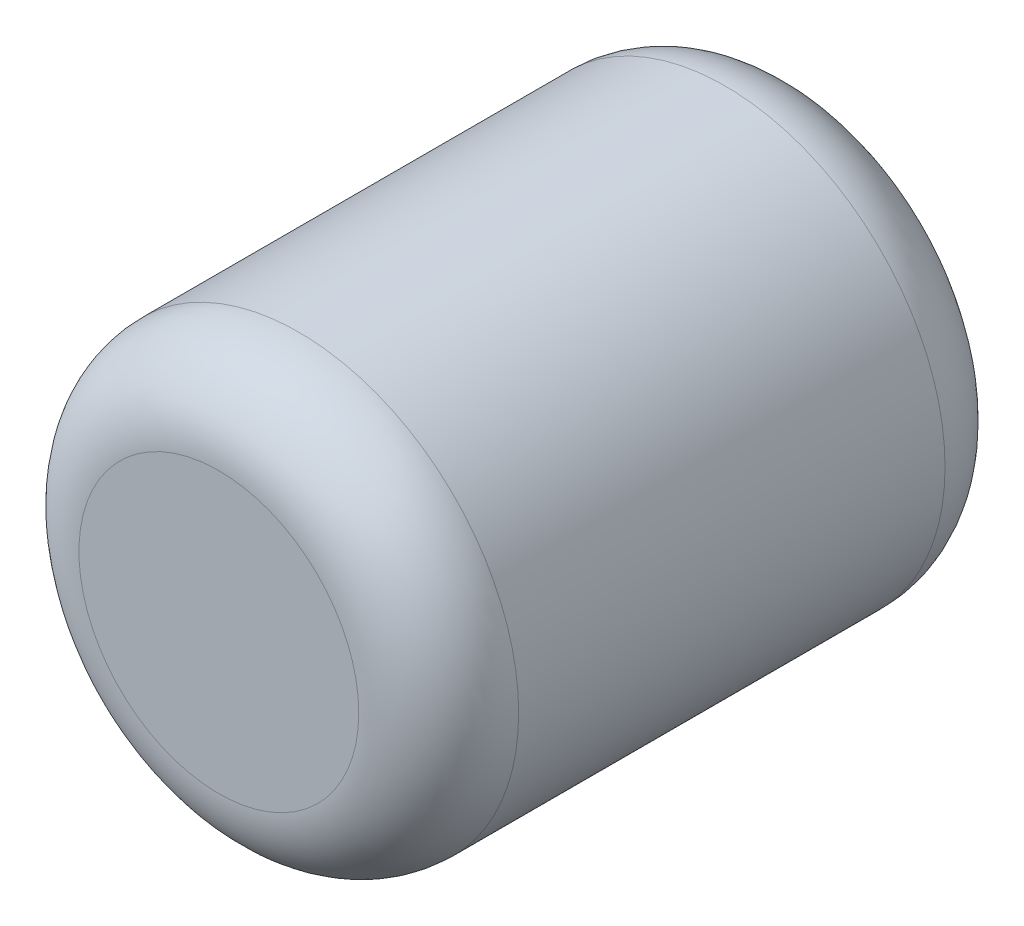
ISO-10303-21;
HEADER;
FILE_DESCRIPTION(('STEP AP214'),'2;1');
FILE_NAME('part.step','',(''),(''),'','','');
FILE_SCHEMA(('AUTOMOTIVE_DESIGN { 1 0 10303 214 1 1 1 1 }'));
ENDSEC;
DATA;
#1=APPLICATION_CONTEXT('core data for automotive mechanical design processes');
#2=APPLICATION_PROTOCOL_DEFINITION('international standard','automotive_design',2000,#1);
#3=PRODUCT_CONTEXT('',#1,'mechanical');
#4=PRODUCT('Part','Part','',(#3));
#5=PRODUCT_RELATED_PRODUCT_CATEGORY('part','',(#4));
#6=PRODUCT_DEFINITION_FORMATION('','',#4);
#7=PRODUCT_DEFINITION_CONTEXT('part definition',#1,'design');
#8=PRODUCT_DEFINITION('design','',#6,#7);
#9=PRODUCT_DEFINITION_SHAPE('','',#8);
#10=(LENGTH_UNIT() NAMED_UNIT(*) SI_UNIT(.MILLI.,.METRE.));
#11=(NAMED_UNIT(*) PLANE_ANGLE_UNIT() SI_UNIT($,.RADIAN.));
#12=(NAMED_UNIT(*) SI_UNIT($,.STERADIAN.) SOLID_ANGLE_UNIT());
#13=UNCERTAINTY_MEASURE_WITH_UNIT(LENGTH_MEASURE(1.E-05),#10,'distance_accuracy_value','');
#14=(GEOMETRIC_REPRESENTATION_CONTEXT(3) GLOBAL_UNCERTAINTY_ASSIGNED_CONTEXT((#13)) GLOBAL_UNIT_ASSIGNED_CONTEXT((#10,
#11,#12)) REPRESENTATION_CONTEXT('',''));
#15=CARTESIAN_POINT('',(0.,0.,0.));
#16=DIRECTION('',(0.,0.,1.));
#17=DIRECTION('',(1.,0.,0.));
#18=AXIS2_PLACEMENT_3D('',#15,#16,#17);
#19=CARTESIAN_POINT('',(0.,0.,22.));
#20=DIRECTION('',(0.,0.,-1.));
#21=DIRECTION('',(-1.,0.,0.));
#22=AXIS2_PLACEMENT_3D('',#19,#20,#21);
#23=CYLINDRICAL_SURFACE('',#22,8.25);
#24=CARTESIAN_POINT('',(0.,0.,19.));
#25=DIRECTION('',(0.,0.,1.));
#26=DIRECTION('',(1.,0.,0.));
#27=AXIS2_PLACEMENT_3D('',#24,#25,#26);
#28=CIRCLE('',#27,8.25);
#29=CARTESIAN_POINT('',(8.25,0.,19.));
#30=VERTEX_POINT('',#29);
#31=EDGE_CURVE('E42',#30,#30,#28,.F.);
#32=ORIENTED_EDGE('',*,*,#31,.T.);
#33=EDGE_LOOP('',(#32));
#34=FACE_BOUND('',#33,.T.);
#35=CARTESIAN_POINT('',(0.,0.,3.));
#36=DIRECTION('',(0.,0.,1.));
#37=DIRECTION('',(1.,0.,0.));
#38=AXIS2_PLACEMENT_3D('',#35,#36,#37);
#39=CIRCLE('',#38,8.25);
#40=CARTESIAN_POINT('',(8.25,0.,3.));
#41=VERTEX_POINT('',#40);
#42=EDGE_CURVE('E46',#41,#41,#39,.T.);
#43=ORIENTED_EDGE('',*,*,#42,.T.);
#44=EDGE_LOOP('',(#43));
#45=FACE_BOUND('',#44,.T.);
#46=ADVANCED_FACE('F35',(#34,#45),#23,.T.);
#47=CARTESIAN_POINT('',(0.,0.,22.));
#48=DIRECTION('',(0.,0.,1.));
#49=DIRECTION('',(1.,0.,0.));
#50=AXIS2_PLACEMENT_3D('',#47,#48,#49);
#51=PLANE('',#50);
#52=CARTESIAN_POINT('',(0.,0.,22.));
#53=DIRECTION('',(0.,0.,1.));
#54=DIRECTION('',(1.,0.,0.));
#55=AXIS2_PLACEMENT_3D('',#52,#53,#54);
#56=CIRCLE('',#55,5.25);
#57=CARTESIAN_POINT('',(5.25,0.,22.));
#58=VERTEX_POINT('',#57);
#59=EDGE_CURVE('E50',#58,#58,#56,.T.);
#60=ORIENTED_EDGE('',*,*,#59,.T.);
#61=EDGE_LOOP('',(#60));
#62=FACE_BOUND('',#61,.T.);
#63=ADVANCED_FACE('F56',(#62),#51,.T.);
#64=CARTESIAN_POINT('',(0.,0.,0.));
#65=DIRECTION('',(0.,0.,1.));
#66=DIRECTION('',(1.,0.,0.));
#67=AXIS2_PLACEMENT_3D('',#64,#65,#66);
#68=PLANE('',#67);
#69=CARTESIAN_POINT('',(0.,0.,0.));
#70=DIRECTION('',(0.,0.,1.));
#71=DIRECTION('',(1.,0.,0.));
#72=AXIS2_PLACEMENT_3D('',#69,#70,#71);
#73=CIRCLE('',#72,5.25);
#74=CARTESIAN_POINT('',(5.25,0.,0.));
#75=VERTEX_POINT('',#74);
#76=EDGE_CURVE('E10',#75,#75,#73,.F.);
#77=ORIENTED_EDGE('',*,*,#76,.T.);
#78=EDGE_LOOP('',(#77));
#79=FACE_BOUND('',#78,.T.);
#80=ADVANCED_FACE('F60',(#79),#68,.F.);
#81=CARTESIAN_POINT('',(0.,0.,19.));
#82=DIRECTION('',(0.,0.,1.));
#83=DIRECTION('',(1.,0.,0.));
#84=AXIS2_PLACEMENT_3D('',#81,#82,#83);
#85=TOROIDAL_SURFACE('',#84,5.25,3.);
#86=ORIENTED_EDGE('',*,*,#31,.F.);
#87=EDGE_LOOP('',(#86));
#88=FACE_BOUND('',#87,.T.);
#89=ORIENTED_EDGE('',*,*,#59,.F.);
#90=EDGE_LOOP('',(#89));
#91=FACE_BOUND('',#90,.T.);
#92=ADVANCED_FACE('F58',(#88,#91),#85,.T.);
#93=CARTESIAN_POINT('',(0.,0.,3.));
#94=DIRECTION('',(0.,0.,1.));
#95=DIRECTION('',(1.,0.,0.));
#96=AXIS2_PLACEMENT_3D('',#93,#94,#95);
#97=TOROIDAL_SURFACE('',#96,5.25,3.);
#98=ORIENTED_EDGE('',*,*,#76,.F.);
#99=EDGE_LOOP('',(#98));
#100=FACE_BOUND('',#99,.T.);
#101=ORIENTED_EDGE('',*,*,#42,.F.);
#102=EDGE_LOOP('',(#101));
#103=FACE_BOUND('',#102,.T.);
#104=ADVANCED_FACE('F37',(#100,#103),#97,.T.);
#105=CLOSED_SHELL('',(#46,#63,#80,#92,#104));
#106=MANIFOLD_SOLID_BREP('B2',#105);
#107=ADVANCED_BREP_SHAPE_REPRESENTATION('',(#18,#106),#14);
#108=SHAPE_DEFINITION_REPRESENTATION(#9,#107);
ENDSEC;
END-ISO-10303-21;
